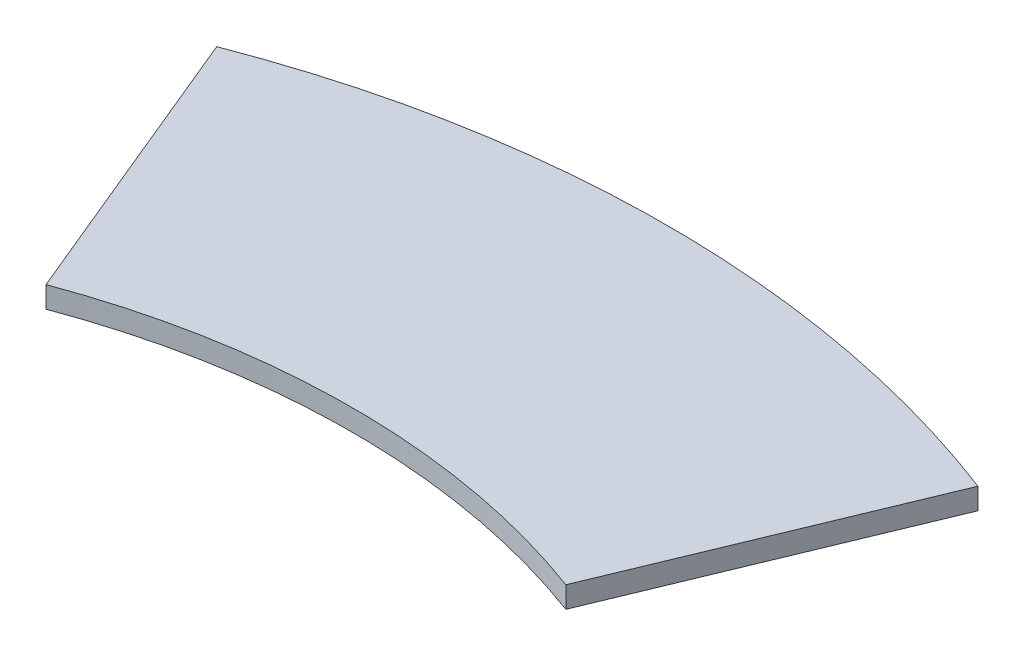
ISO-10303-21;
HEADER;
FILE_DESCRIPTION(('STEP AP214'),'2;1');
FILE_NAME('part.step','',(''),(''),'','','');
FILE_SCHEMA(('AUTOMOTIVE_DESIGN { 1 0 10303 214 1 1 1 1 }'));
ENDSEC;
DATA;
#1=APPLICATION_CONTEXT('core data for automotive mechanical design processes');
#2=APPLICATION_PROTOCOL_DEFINITION('international standard','automotive_design',2000,#1);
#3=PRODUCT_CONTEXT('',#1,'mechanical');
#4=PRODUCT('Part','Part','',(#3));
#5=PRODUCT_RELATED_PRODUCT_CATEGORY('part','',(#4));
#6=PRODUCT_DEFINITION_FORMATION('','',#4);
#7=PRODUCT_DEFINITION_CONTEXT('part definition',#1,'design');
#8=PRODUCT_DEFINITION('design','',#6,#7);
#9=PRODUCT_DEFINITION_SHAPE('','',#8);
#10=(LENGTH_UNIT() NAMED_UNIT(*) SI_UNIT(.MILLI.,.METRE.));
#11=(NAMED_UNIT(*) PLANE_ANGLE_UNIT() SI_UNIT($,.RADIAN.));
#12=(NAMED_UNIT(*) SI_UNIT($,.STERADIAN.) SOLID_ANGLE_UNIT());
#13=UNCERTAINTY_MEASURE_WITH_UNIT(LENGTH_MEASURE(1.E-05),#10,'distance_accuracy_value','');
#14=(GEOMETRIC_REPRESENTATION_CONTEXT(3) GLOBAL_UNCERTAINTY_ASSIGNED_CONTEXT((#13)) GLOBAL_UNIT_ASSIGNED_CONTEXT((#10,
#11,#12)) REPRESENTATION_CONTEXT('',''));
#15=CARTESIAN_POINT('',(0.,0.,0.));
#16=DIRECTION('',(0.,0.,1.));
#17=DIRECTION('',(1.,0.,0.));
#18=AXIS2_PLACEMENT_3D('',#15,#16,#17);
#19=CARTESIAN_POINT('',(0.610072250697591,5.,413.510840334842));
#20=DIRECTION('',(0.,-1.,0.));
#21=DIRECTION('',(0.,0.,-1.));
#22=AXIS2_PLACEMENT_3D('',#19,#20,#21);
#23=CYLINDRICAL_SURFACE('',#22,499.);
#24=CARTESIAN_POINT('',(0.610072250697591,-5.,413.510840334842));
#25=DIRECTION('',(0.,1.,0.));
#26=DIRECTION('',(0.,0.,1.));
#27=AXIS2_PLACEMENT_3D('',#24,#25,#26);
#28=CIRCLE('',#27,499.);
#29=CARTESIAN_POINT('',(179.293640982489,-5.,-52.4002909608923));
#30=VERTEX_POINT('',#29);
#31=CARTESIAN_POINT('',(-178.073496481093,-5.,-52.4002909608923));
#32=VERTEX_POINT('',#31);
#33=EDGE_CURVE('E96',#30,#32,#28,.T.);
#34=ORIENTED_EDGE('',*,*,#33,.T.);
#35=DIRECTION('',(0.,-1.,0.));
#36=VECTOR('',#35,1.);
#37=CARTESIAN_POINT('',(-178.073496481093,5.,-52.4002909608923));
#38=LINE('',#37,#36);
#39=CARTESIAN_POINT('',(-178.073496481093,5.,-52.4002909608923));
#40=VERTEX_POINT('',#39);
#41=EDGE_CURVE('E11',#40,#32,#38,.T.);
#42=ORIENTED_EDGE('',*,*,#41,.F.);
#43=CARTESIAN_POINT('',(0.610072250697591,5.,413.510840334842));
#44=DIRECTION('',(0.,1.,0.));
#45=DIRECTION('',(0.,0.,1.));
#46=AXIS2_PLACEMENT_3D('',#43,#44,#45);
#47=CIRCLE('',#46,499.);
#48=CARTESIAN_POINT('',(179.293640982489,5.,-52.4002909608923));
#49=VERTEX_POINT('',#48);
#50=EDGE_CURVE('E84',#49,#40,#47,.T.);
#51=ORIENTED_EDGE('',*,*,#50,.F.);
#52=DIRECTION('',(0.,-1.,0.));
#53=VECTOR('',#52,1.);
#54=CARTESIAN_POINT('',(179.293640982489,5.,-52.4002909608923));
#55=LINE('',#54,#53);
#56=EDGE_CURVE('E92',#49,#30,#55,.T.);
#57=ORIENTED_EDGE('',*,*,#56,.T.);
#58=EDGE_LOOP('',(#34,#42,#51,#57));
#59=FACE_BOUND('',#58,.T.);
#60=ADVANCED_FACE('F33',(#59),#23,.T.);
#61=CARTESIAN_POINT('',(-178.073496481093,5.,-52.4002909608923));
#62=DIRECTION('',(0.923879532511288,0.,-0.382683432365087));
#63=DIRECTION('',(-0.382683432365087,0.,-0.923879532511288));
#64=AXIS2_PLACEMENT_3D('',#61,#62,#63);
#65=PLANE('',#64);
#66=DIRECTION('',(0.382683432365087,0.,0.923879532511288));
#67=VECTOR('',#66,1.);
#68=CARTESIAN_POINT('',(-178.073496481093,-5.,-52.4002909608923));
#69=LINE('',#68,#67);
#70=CARTESIAN_POINT('',(-121.408093467159,-5.,84.4020935126868));
#71=VERTEX_POINT('',#70);
#72=EDGE_CURVE('E88',#32,#71,#69,.T.);
#73=ORIENTED_EDGE('',*,*,#72,.T.);
#74=DIRECTION('',(0.,-1.,0.));
#75=VECTOR('',#74,1.);
#76=CARTESIAN_POINT('',(-121.408093467159,5.,84.4020935126868));
#77=LINE('',#76,#75);
#78=CARTESIAN_POINT('',(-121.408093467159,5.,84.4020935126868));
#79=VERTEX_POINT('',#78);
#80=EDGE_CURVE('E41',#79,#71,#77,.T.);
#81=ORIENTED_EDGE('',*,*,#80,.F.);
#82=DIRECTION('',(0.382683432365087,0.,0.923879532511288));
#83=VECTOR('',#82,1.);
#84=CARTESIAN_POINT('',(-178.073496481093,5.,-52.4002909608923));
#85=LINE('',#84,#83);
#86=EDGE_CURVE('E79',#40,#79,#85,.T.);
#87=ORIENTED_EDGE('',*,*,#86,.F.);
#88=ORIENTED_EDGE('',*,*,#41,.T.);
#89=EDGE_LOOP('',(#73,#81,#87,#88));
#90=FACE_BOUND('',#89,.T.);
#91=ADVANCED_FACE('F87',(#90),#65,.F.);
#92=CARTESIAN_POINT('',(0.610072250697591,5.,413.510840334842));
#93=DIRECTION('',(0.,-1.,0.));
#94=DIRECTION('',(0.,0.,-1.));
#95=AXIS2_PLACEMENT_3D('',#92,#93,#94);
#96=CYLINDRICAL_SURFACE('',#95,351.);
#97=CARTESIAN_POINT('',(0.610072250697591,-5.,413.510840334842));
#98=DIRECTION('',(0.,-1.,0.));
#99=DIRECTION('',(0.,0.,-1.));
#100=AXIS2_PLACEMENT_3D('',#97,#98,#99);
#101=CIRCLE('',#100,351.);
#102=CARTESIAN_POINT('',(122.628237968554,-5.,84.4020935126867));
#103=VERTEX_POINT('',#102);
#104=EDGE_CURVE('E66',#71,#103,#101,.T.);
#105=ORIENTED_EDGE('',*,*,#104,.T.);
#106=DIRECTION('',(0.,-1.,0.));
#107=VECTOR('',#106,1.);
#108=CARTESIAN_POINT('',(122.628237968554,5.,84.4020935126867));
#109=LINE('',#108,#107);
#110=CARTESIAN_POINT('',(122.628237968554,5.,84.4020935126867));
#111=VERTEX_POINT('',#110);
#112=EDGE_CURVE('E89',#111,#103,#109,.T.);
#113=ORIENTED_EDGE('',*,*,#112,.F.);
#114=CARTESIAN_POINT('',(0.610072250697591,5.,413.510840334842));
#115=DIRECTION('',(0.,-1.,0.));
#116=DIRECTION('',(0.,0.,-1.));
#117=AXIS2_PLACEMENT_3D('',#114,#115,#116);
#118=CIRCLE('',#117,351.);
#119=EDGE_CURVE('E82',#79,#111,#118,.T.);
#120=ORIENTED_EDGE('',*,*,#119,.F.);
#121=ORIENTED_EDGE('',*,*,#80,.T.);
#122=EDGE_LOOP('',(#105,#113,#120,#121));
#123=FACE_BOUND('',#122,.T.);
#124=ADVANCED_FACE('F90',(#123),#96,.F.);
#125=CARTESIAN_POINT('',(122.628237968554,5.,84.4020935126868));
#126=DIRECTION('',(-0.923879532511288,0.,-0.382683432365087));
#127=DIRECTION('',(-0.382683432365087,0.,0.923879532511288));
#128=AXIS2_PLACEMENT_3D('',#125,#126,#127);
#129=PLANE('',#128);
#130=DIRECTION('',(0.382683432365087,0.,-0.923879532511288));
#131=VECTOR('',#130,1.);
#132=CARTESIAN_POINT('',(122.628237968554,-5.,84.4020935126868));
#133=LINE('',#132,#131);
#134=EDGE_CURVE('E72',#103,#30,#133,.T.);
#135=ORIENTED_EDGE('',*,*,#134,.T.);
#136=ORIENTED_EDGE('',*,*,#56,.F.);
#137=DIRECTION('',(0.382683432365087,0.,-0.923879532511288));
#138=VECTOR('',#137,1.);
#139=CARTESIAN_POINT('',(122.628237968554,5.,84.4020935126868));
#140=LINE('',#139,#138);
#141=EDGE_CURVE('E49',#111,#49,#140,.T.);
#142=ORIENTED_EDGE('',*,*,#141,.F.);
#143=ORIENTED_EDGE('',*,*,#112,.T.);
#144=EDGE_LOOP('',(#135,#136,#142,#143));
#145=FACE_BOUND('',#144,.T.);
#146=ADVANCED_FACE('F103',(#145),#129,.F.);
#147=CARTESIAN_POINT('',(0.610072250697591,5.,413.510840334842));
#148=DIRECTION('',(0.,1.,0.));
#149=DIRECTION('',(0.,0.,1.));
#150=AXIS2_PLACEMENT_3D('',#147,#148,#149);
#151=PLANE('',#150);
#152=ORIENTED_EDGE('',*,*,#50,.T.);
#153=ORIENTED_EDGE('',*,*,#86,.T.);
#154=ORIENTED_EDGE('',*,*,#119,.T.);
#155=ORIENTED_EDGE('',*,*,#141,.T.);
#156=EDGE_LOOP('',(#152,#153,#154,#155));
#157=FACE_BOUND('',#156,.T.);
#158=ADVANCED_FACE('F80',(#157),#151,.T.);
#159=CARTESIAN_POINT('',(0.610072250697591,-5.,413.510840334842));
#160=DIRECTION('',(0.,1.,0.));
#161=DIRECTION('',(0.,0.,1.));
#162=AXIS2_PLACEMENT_3D('',#159,#160,#161);
#163=PLANE('',#162);
#164=ORIENTED_EDGE('',*,*,#33,.F.);
#165=ORIENTED_EDGE('',*,*,#134,.F.);
#166=ORIENTED_EDGE('',*,*,#104,.F.);
#167=ORIENTED_EDGE('',*,*,#72,.F.);
#168=EDGE_LOOP('',(#164,#165,#166,#167));
#169=FACE_BOUND('',#168,.T.);
#170=ADVANCED_FACE('F106',(#169),#163,.F.);
#171=CLOSED_SHELL('',(#60,#91,#124,#146,#158,#170));
#172=MANIFOLD_SOLID_BREP('B2',#171);
#173=ADVANCED_BREP_SHAPE_REPRESENTATION('',(#18,#172),#14);
#174=SHAPE_DEFINITION_REPRESENTATION(#9,#173);
ENDSEC;
END-ISO-10303-21;
